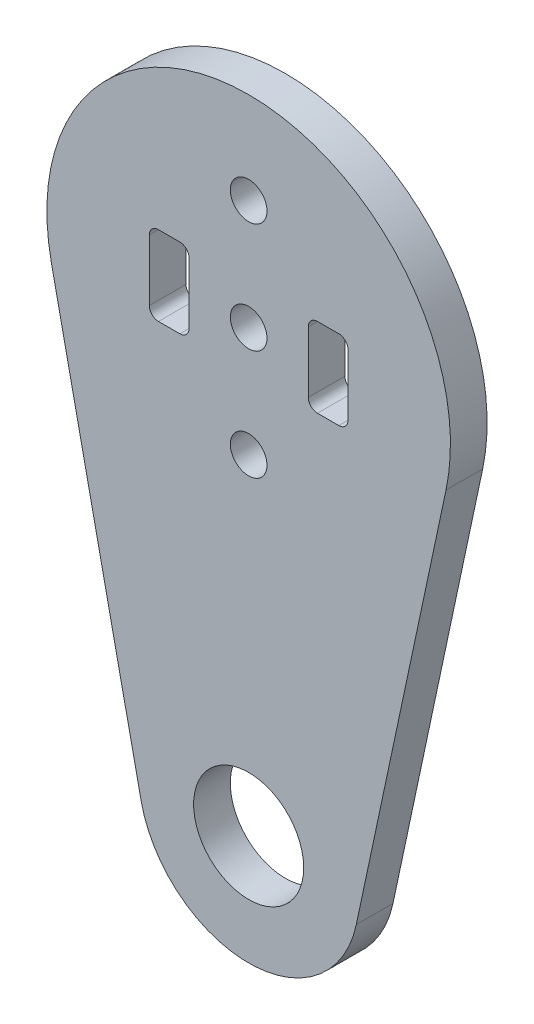
ISO-10303-21;
HEADER;
FILE_DESCRIPTION(('STEP AP214'),'2;1');
FILE_NAME('part.step','',(''),(''),'','','');
FILE_SCHEMA(('AUTOMOTIVE_DESIGN { 1 0 10303 214 1 1 1 1 }'));
ENDSEC;
DATA;
#1=APPLICATION_CONTEXT('core data for automotive mechanical design processes');
#2=APPLICATION_PROTOCOL_DEFINITION('international standard','automotive_design',2000,#1);
#3=PRODUCT_CONTEXT('',#1,'mechanical');
#4=PRODUCT('Part','Part','',(#3));
#5=PRODUCT_RELATED_PRODUCT_CATEGORY('part','',(#4));
#6=PRODUCT_DEFINITION_FORMATION('','',#4);
#7=PRODUCT_DEFINITION_CONTEXT('part definition',#1,'design');
#8=PRODUCT_DEFINITION('design','',#6,#7);
#9=PRODUCT_DEFINITION_SHAPE('','',#8);
#10=(LENGTH_UNIT() NAMED_UNIT(*) SI_UNIT(.MILLI.,.METRE.));
#11=(NAMED_UNIT(*) PLANE_ANGLE_UNIT() SI_UNIT($,.RADIAN.));
#12=(NAMED_UNIT(*) SI_UNIT($,.STERADIAN.) SOLID_ANGLE_UNIT());
#13=UNCERTAINTY_MEASURE_WITH_UNIT(LENGTH_MEASURE(1.E-05),#10,'distance_accuracy_value','');
#14=(GEOMETRIC_REPRESENTATION_CONTEXT(3) GLOBAL_UNCERTAINTY_ASSIGNED_CONTEXT((#13)) GLOBAL_UNIT_ASSIGNED_CONTEXT((#10,
#11,#12)) REPRESENTATION_CONTEXT('',''));
#15=CARTESIAN_POINT('',(0.,0.,0.));
#16=DIRECTION('',(0.,0.,1.));
#17=DIRECTION('',(1.,0.,0.));
#18=AXIS2_PLACEMENT_3D('',#15,#16,#17);
#19=CARTESIAN_POINT('',(215.7478079135,205.9520199932,3.));
#20=DIRECTION('',(0.,0.,1.));
#21=DIRECTION('',(1.,0.,0.));
#22=AXIS2_PLACEMENT_3D('',#19,#20,#21);
#23=PLANE('',#22);
#24=DIRECTION('',(-1.,0.,0.));
#25=VECTOR('',#24,1.);
#26=CARTESIAN_POINT('',(208.3728079135,245.2020199932,3.));
#27=LINE('',#26,#25);
#28=CARTESIAN_POINT('',(210.1228079135,245.2020199932,3.));
#29=VERTEX_POINT('',#28);
#30=CARTESIAN_POINT('',(208.3728079135,245.2020199932,3.));
#31=VERTEX_POINT('',#30);
#32=EDGE_CURVE('E178',#29,#31,#27,.T.);
#33=ORIENTED_EDGE('',*,*,#32,.F.);
#34=CARTESIAN_POINT('',(210.1228079135,244.4520199932,3.));
#35=DIRECTION('',(0.,0.,1.));
#36=DIRECTION('',(1.,0.,0.));
#37=AXIS2_PLACEMENT_3D('',#34,#35,#36);
#38=CIRCLE('',#37,0.750000000000001);
#39=CARTESIAN_POINT('',(210.8728079135,244.4520199932,3.));
#40=VERTEX_POINT('',#39);
#41=EDGE_CURVE('E170',#40,#29,#38,.T.);
#42=ORIENTED_EDGE('',*,*,#41,.F.);
#43=DIRECTION('',(0.,1.,0.));
#44=VECTOR('',#43,1.);
#45=CARTESIAN_POINT('',(210.8728079135,244.4520199932,3.));
#46=LINE('',#45,#44);
#47=CARTESIAN_POINT('',(210.8728079135,239.4520199932,3.));
#48=VERTEX_POINT('',#47);
#49=EDGE_CURVE('E205',#48,#40,#46,.T.);
#50=ORIENTED_EDGE('',*,*,#49,.F.);
#51=CARTESIAN_POINT('',(210.1228079135,239.4520199932,3.));
#52=DIRECTION('',(0.,0.,1.));
#53=DIRECTION('',(1.,0.,0.));
#54=AXIS2_PLACEMENT_3D('',#51,#52,#53);
#55=CIRCLE('',#54,0.750000000000001);
#56=CARTESIAN_POINT('',(210.1228079135,238.7020199932,3.));
#57=VERTEX_POINT('',#56);
#58=EDGE_CURVE('E203',#57,#48,#55,.T.);
#59=ORIENTED_EDGE('',*,*,#58,.F.);
#60=DIRECTION('',(1.,0.,0.));
#61=VECTOR('',#60,1.);
#62=CARTESIAN_POINT('',(210.1228079135,238.7020199932,3.));
#63=LINE('',#62,#61);
#64=CARTESIAN_POINT('',(208.3728079135,238.7020199932,3.));
#65=VERTEX_POINT('',#64);
#66=EDGE_CURVE('E201',#65,#57,#63,.T.);
#67=ORIENTED_EDGE('',*,*,#66,.F.);
#68=CARTESIAN_POINT('',(208.3728079135,239.4520199932,3.));
#69=DIRECTION('',(0.,0.,1.));
#70=DIRECTION('',(1.,0.,0.));
#71=AXIS2_PLACEMENT_3D('',#68,#69,#70);
#72=CIRCLE('',#71,0.750000000000237);
#73=CARTESIAN_POINT('',(207.6228079135,239.4520199932,3.));
#74=VERTEX_POINT('',#73);
#75=EDGE_CURVE('E199',#74,#65,#72,.T.);
#76=ORIENTED_EDGE('',*,*,#75,.F.);
#77=DIRECTION('',(0.,-1.,0.));
#78=VECTOR('',#77,1.);
#79=CARTESIAN_POINT('',(207.6228079135,239.4520199932,3.));
#80=LINE('',#79,#78);
#81=CARTESIAN_POINT('',(207.6228079135,244.4520199932,3.));
#82=VERTEX_POINT('',#81);
#83=EDGE_CURVE('E194',#82,#74,#80,.T.);
#84=ORIENTED_EDGE('',*,*,#83,.F.);
#85=CARTESIAN_POINT('',(208.3728079135,244.4520199932,3.));
#86=DIRECTION('',(0.,0.,1.));
#87=DIRECTION('',(1.,0.,0.));
#88=AXIS2_PLACEMENT_3D('',#85,#86,#87);
#89=CIRCLE('',#88,0.750000000000001);
#90=EDGE_CURVE('E192',#31,#82,#89,.T.);
#91=ORIENTED_EDGE('',*,*,#90,.F.);
#92=EDGE_LOOP('',(#33,#42,#50,#59,#67,#76,#84,#91));
#93=FACE_BOUND('',#92,.T.);
#94=CARTESIAN_POINT('',(215.7478079135,250.9520199932,3.));
#95=DIRECTION('',(0.,0.,1.));
#96=DIRECTION('',(1.,0.,0.));
#97=AXIS2_PLACEMENT_3D('',#94,#95,#96);
#98=CIRCLE('',#97,1.5);
#99=CARTESIAN_POINT('',(217.2478079135,250.9520199932,3.));
#100=VERTEX_POINT('',#99);
#101=EDGE_CURVE('E297',#100,#100,#98,.T.);
#102=ORIENTED_EDGE('',*,*,#101,.F.);
#103=EDGE_LOOP('',(#102));
#104=FACE_BOUND('',#103,.T.);
#105=CARTESIAN_POINT('',(215.7478079135,241.9520199932,3.));
#106=DIRECTION('',(0.,0.,1.));
#107=DIRECTION('',(1.,0.,0.));
#108=AXIS2_PLACEMENT_3D('',#105,#106,#107);
#109=CIRCLE('',#108,1.5);
#110=CARTESIAN_POINT('',(217.2478079135,241.9520199932,3.));
#111=VERTEX_POINT('',#110);
#112=EDGE_CURVE('E309',#111,#111,#109,.T.);
#113=ORIENTED_EDGE('',*,*,#112,.F.);
#114=EDGE_LOOP('',(#113));
#115=FACE_BOUND('',#114,.T.);
#116=CARTESIAN_POINT('',(215.7478079135,205.9520199932,3.));
#117=DIRECTION('',(0.,0.,1.));
#118=DIRECTION('',(1.,0.,0.));
#119=AXIS2_PLACEMENT_3D('',#116,#117,#118);
#120=CIRCLE('',#119,8.99999999997151);
#121=CARTESIAN_POINT('',(206.9452869678,204.0770199932,3.));
#122=VERTEX_POINT('',#121);
#123=CARTESIAN_POINT('',(224.5503288592,204.0770199932,3.));
#124=VERTEX_POINT('',#123);
#125=EDGE_CURVE('E315',#122,#124,#120,.T.);
#126=ORIENTED_EDGE('',*,*,#125,.T.);
#127=DIRECTION('',(0.208333333334938,0.97805788285845,0.));
#128=VECTOR('',#127,1.);
#129=CARTESIAN_POINT('',(231.8857629807,238.5145199932,3.));
#130=LINE('',#129,#128);
#131=CARTESIAN_POINT('',(231.8857629807,238.5145199932,3.));
#132=VERTEX_POINT('',#131);
#133=EDGE_CURVE('E318',#124,#132,#130,.T.);
#134=ORIENTED_EDGE('',*,*,#133,.T.);
#135=CARTESIAN_POINT('',(215.7478079135,241.9520199932,3.));
#136=DIRECTION('',(0.,0.,1.));
#137=DIRECTION('',(1.,0.,0.));
#138=AXIS2_PLACEMENT_3D('',#135,#136,#137);
#139=CIRCLE('',#138,16.5000000000293);
#140=CARTESIAN_POINT('',(199.6098528463,238.5145199932,3.));
#141=VERTEX_POINT('',#140);
#142=EDGE_CURVE('E321',#132,#141,#139,.T.);
#143=ORIENTED_EDGE('',*,*,#142,.T.);
#144=DIRECTION('',(0.208333333334939,-0.97805788285845,0.));
#145=VECTOR('',#144,1.);
#146=CARTESIAN_POINT('',(206.9452869678,204.0770199932,3.));
#147=LINE('',#146,#145);
#148=EDGE_CURVE('E323',#141,#122,#147,.T.);
#149=ORIENTED_EDGE('',*,*,#148,.T.);
#150=EDGE_LOOP('',(#126,#134,#143,#149));
#151=FACE_BOUND('',#150,.T.);
#152=CARTESIAN_POINT('',(215.7478079135,232.9520199932,3.));
#153=DIRECTION('',(0.,0.,1.));
#154=DIRECTION('',(1.,0.,0.));
#155=AXIS2_PLACEMENT_3D('',#152,#153,#154);
#156=CIRCLE('',#155,1.5);
#157=CARTESIAN_POINT('',(217.2478079135,232.9520199932,3.));
#158=VERTEX_POINT('',#157);
#159=EDGE_CURVE('E303',#158,#158,#156,.T.);
#160=ORIENTED_EDGE('',*,*,#159,.F.);
#161=EDGE_LOOP('',(#160));
#162=FACE_BOUND('',#161,.T.);
#163=DIRECTION('',(0.,-1.,0.));
#164=VECTOR('',#163,1.);
#165=CARTESIAN_POINT('',(220.6228079135,244.4520199932,3.));
#166=LINE('',#165,#164);
#167=CARTESIAN_POINT('',(220.6228079135,244.4520199932,3.));
#168=VERTEX_POINT('',#167);
#169=CARTESIAN_POINT('',(220.6228079135,239.4520199932,3.));
#170=VERTEX_POINT('',#169);
#171=EDGE_CURVE('E240',#168,#170,#166,.T.);
#172=ORIENTED_EDGE('',*,*,#171,.F.);
#173=CARTESIAN_POINT('',(221.3728079135,244.4520199932,3.));
#174=DIRECTION('',(0.,0.,1.));
#175=DIRECTION('',(1.,0.,0.));
#176=AXIS2_PLACEMENT_3D('',#173,#174,#175);
#177=CIRCLE('',#176,0.750000000000001);
#178=CARTESIAN_POINT('',(221.3728079135,245.2020199932,3.));
#179=VERTEX_POINT('',#178);
#180=EDGE_CURVE('E238',#179,#168,#177,.T.);
#181=ORIENTED_EDGE('',*,*,#180,.F.);
#182=DIRECTION('',(-1.,0.,0.));
#183=VECTOR('',#182,1.);
#184=CARTESIAN_POINT('',(223.1228079135,245.2020199932,3.));
#185=LINE('',#184,#183);
#186=CARTESIAN_POINT('',(223.1228079135,245.2020199932,3.));
#187=VERTEX_POINT('',#186);
#188=EDGE_CURVE('E254',#187,#179,#185,.T.);
#189=ORIENTED_EDGE('',*,*,#188,.F.);
#190=CARTESIAN_POINT('',(223.1228079135,244.4520199932,3.));
#191=DIRECTION('',(0.,0.,1.));
#192=DIRECTION('',(1.,0.,0.));
#193=AXIS2_PLACEMENT_3D('',#190,#191,#192);
#194=CIRCLE('',#193,0.750000000000001);
#195=CARTESIAN_POINT('',(223.8728079135,244.4520199932,3.));
#196=VERTEX_POINT('',#195);
#197=EDGE_CURVE('E251',#196,#187,#194,.T.);
#198=ORIENTED_EDGE('',*,*,#197,.F.);
#199=DIRECTION('',(0.,1.,0.));
#200=VECTOR('',#199,1.);
#201=CARTESIAN_POINT('',(223.8728079135,239.4520199932,3.));
#202=LINE('',#201,#200);
#203=CARTESIAN_POINT('',(223.8728079135,239.4520199932,3.));
#204=VERTEX_POINT('',#203);
#205=EDGE_CURVE('E249',#204,#196,#202,.T.);
#206=ORIENTED_EDGE('',*,*,#205,.F.);
#207=CARTESIAN_POINT('',(223.1228079135,239.4520199932,3.));
#208=DIRECTION('',(0.,0.,1.));
#209=DIRECTION('',(1.,0.,0.));
#210=AXIS2_PLACEMENT_3D('',#207,#208,#209);
#211=CIRCLE('',#210,0.750000000000001);
#212=CARTESIAN_POINT('',(223.1228079135,238.7020199932,3.));
#213=VERTEX_POINT('',#212);
#214=EDGE_CURVE('E247',#213,#204,#211,.T.);
#215=ORIENTED_EDGE('',*,*,#214,.F.);
#216=DIRECTION('',(1.,0.,0.));
#217=VECTOR('',#216,1.);
#218=CARTESIAN_POINT('',(221.3728079135,238.7020199932,3.));
#219=LINE('',#218,#217);
#220=CARTESIAN_POINT('',(221.3728079135,238.7020199932,3.));
#221=VERTEX_POINT('',#220);
#222=EDGE_CURVE('E245',#221,#213,#219,.T.);
#223=ORIENTED_EDGE('',*,*,#222,.F.);
#224=CARTESIAN_POINT('',(221.3728079135,239.4520199932,3.));
#225=DIRECTION('',(0.,0.,1.));
#226=DIRECTION('',(1.,0.,0.));
#227=AXIS2_PLACEMENT_3D('',#224,#225,#226);
#228=CIRCLE('',#227,0.750000000000001);
#229=EDGE_CURVE('E243',#170,#221,#228,.T.);
#230=ORIENTED_EDGE('',*,*,#229,.F.);
#231=EDGE_LOOP('',(#172,#181,#189,#198,#206,#215,#223,#230));
#232=FACE_BOUND('',#231,.T.);
#233=CARTESIAN_POINT('',(215.7478079135,205.9520199932,3.));
#234=DIRECTION('',(0.,0.,1.));
#235=DIRECTION('',(1.,0.,0.));
#236=AXIS2_PLACEMENT_3D('',#233,#234,#235);
#237=CIRCLE('',#236,4.5);
#238=CARTESIAN_POINT('',(220.2478079135,205.9520199932,3.));
#239=VERTEX_POINT('',#238);
#240=EDGE_CURVE('E208',#239,#239,#237,.T.);
#241=ORIENTED_EDGE('',*,*,#240,.F.);
#242=EDGE_LOOP('',(#241));
#243=FACE_BOUND('',#242,.T.);
#244=ADVANCED_FACE('F33',(#93,#104,#115,#151,#162,#232,#243),#23,.T.);
#245=CARTESIAN_POINT('',(215.7478079135,205.9520199932,0.));
#246=DIRECTION('',(0.,0.,1.));
#247=DIRECTION('',(1.,0.,0.));
#248=AXIS2_PLACEMENT_3D('',#245,#246,#247);
#249=PLANE('',#248);
#250=CARTESIAN_POINT('',(210.1228079135,244.4520199932,0.));
#251=DIRECTION('',(0.,0.,1.));
#252=DIRECTION('',(1.,0.,0.));
#253=AXIS2_PLACEMENT_3D('',#250,#251,#252);
#254=CIRCLE('',#253,0.750000000000001);
#255=CARTESIAN_POINT('',(210.8728079135,244.4520199932,0.));
#256=VERTEX_POINT('',#255);
#257=CARTESIAN_POINT('',(210.1228079135,245.2020199932,0.));
#258=VERTEX_POINT('',#257);
#259=EDGE_CURVE('E56',#256,#258,#254,.T.);
#260=ORIENTED_EDGE('',*,*,#259,.T.);
#261=DIRECTION('',(-1.,0.,0.));
#262=VECTOR('',#261,1.);
#263=CARTESIAN_POINT('',(208.3728079135,245.2020199932,0.));
#264=LINE('',#263,#262);
#265=CARTESIAN_POINT('',(208.3728079135,245.2020199932,0.));
#266=VERTEX_POINT('',#265);
#267=EDGE_CURVE('E185',#258,#266,#264,.T.);
#268=ORIENTED_EDGE('',*,*,#267,.T.);
#269=CARTESIAN_POINT('',(208.3728079135,244.4520199932,0.));
#270=DIRECTION('',(0.,0.,1.));
#271=DIRECTION('',(1.,0.,0.));
#272=AXIS2_PLACEMENT_3D('',#269,#270,#271);
#273=CIRCLE('',#272,0.750000000000001);
#274=CARTESIAN_POINT('',(207.6228079135,244.4520199932,0.));
#275=VERTEX_POINT('',#274);
#276=EDGE_CURVE('E210',#266,#275,#273,.T.);
#277=ORIENTED_EDGE('',*,*,#276,.T.);
#278=DIRECTION('',(0.,-1.,0.));
#279=VECTOR('',#278,1.);
#280=CARTESIAN_POINT('',(207.6228079135,239.4520199932,0.));
#281=LINE('',#280,#279);
#282=CARTESIAN_POINT('',(207.6228079135,239.4520199932,0.));
#283=VERTEX_POINT('',#282);
#284=EDGE_CURVE('E213',#275,#283,#281,.T.);
#285=ORIENTED_EDGE('',*,*,#284,.T.);
#286=CARTESIAN_POINT('',(208.3728079135,239.4520199932,0.));
#287=DIRECTION('',(0.,0.,1.));
#288=DIRECTION('',(1.,0.,0.));
#289=AXIS2_PLACEMENT_3D('',#286,#287,#288);
#290=CIRCLE('',#289,0.750000000000237);
#291=CARTESIAN_POINT('',(208.3728079135,238.7020199932,0.));
#292=VERTEX_POINT('',#291);
#293=EDGE_CURVE('E216',#283,#292,#290,.T.);
#294=ORIENTED_EDGE('',*,*,#293,.T.);
#295=DIRECTION('',(1.,0.,0.));
#296=VECTOR('',#295,1.);
#297=CARTESIAN_POINT('',(210.1228079135,238.7020199932,0.));
#298=LINE('',#297,#296);
#299=CARTESIAN_POINT('',(210.1228079135,238.7020199932,0.));
#300=VERTEX_POINT('',#299);
#301=EDGE_CURVE('E219',#292,#300,#298,.T.);
#302=ORIENTED_EDGE('',*,*,#301,.T.);
#303=CARTESIAN_POINT('',(210.1228079135,239.4520199932,0.));
#304=DIRECTION('',(0.,0.,1.));
#305=DIRECTION('',(1.,0.,0.));
#306=AXIS2_PLACEMENT_3D('',#303,#304,#305);
#307=CIRCLE('',#306,0.750000000000001);
#308=CARTESIAN_POINT('',(210.8728079135,239.4520199932,0.));
#309=VERTEX_POINT('',#308);
#310=EDGE_CURVE('E222',#300,#309,#307,.T.);
#311=ORIENTED_EDGE('',*,*,#310,.T.);
#312=DIRECTION('',(0.,1.,0.));
#313=VECTOR('',#312,1.);
#314=CARTESIAN_POINT('',(210.8728079135,244.4520199932,0.));
#315=LINE('',#314,#313);
#316=EDGE_CURVE('E179',#309,#256,#315,.T.);
#317=ORIENTED_EDGE('',*,*,#316,.T.);
#318=EDGE_LOOP('',(#260,#268,#277,#285,#294,#302,#311,#317));
#319=FACE_BOUND('',#318,.T.);
#320=CARTESIAN_POINT('',(215.7478079135,250.9520199932,0.));
#321=DIRECTION('',(0.,0.,1.));
#322=DIRECTION('',(1.,0.,0.));
#323=AXIS2_PLACEMENT_3D('',#320,#321,#322);
#324=CIRCLE('',#323,1.5);
#325=CARTESIAN_POINT('',(217.2478079135,250.9520199932,0.));
#326=VERTEX_POINT('',#325);
#327=EDGE_CURVE('E296',#326,#326,#324,.T.);
#328=ORIENTED_EDGE('',*,*,#327,.T.);
#329=EDGE_LOOP('',(#328));
#330=FACE_BOUND('',#329,.T.);
#331=CARTESIAN_POINT('',(215.7478079135,241.9520199932,0.));
#332=DIRECTION('',(0.,0.,1.));
#333=DIRECTION('',(1.,0.,0.));
#334=AXIS2_PLACEMENT_3D('',#331,#332,#333);
#335=CIRCLE('',#334,1.5);
#336=CARTESIAN_POINT('',(217.2478079135,241.9520199932,0.));
#337=VERTEX_POINT('',#336);
#338=EDGE_CURVE('E306',#337,#337,#335,.T.);
#339=ORIENTED_EDGE('',*,*,#338,.T.);
#340=EDGE_LOOP('',(#339));
#341=FACE_BOUND('',#340,.T.);
#342=CARTESIAN_POINT('',(215.7478079135,205.9520199932,0.));
#343=DIRECTION('',(0.,0.,1.));
#344=DIRECTION('',(1.,0.,0.));
#345=AXIS2_PLACEMENT_3D('',#342,#343,#344);
#346=CIRCLE('',#345,8.99999999997151);
#347=CARTESIAN_POINT('',(206.9452869678,204.0770199932,0.));
#348=VERTEX_POINT('',#347);
#349=CARTESIAN_POINT('',(224.5503288592,204.0770199932,0.));
#350=VERTEX_POINT('',#349);
#351=EDGE_CURVE('E312',#348,#350,#346,.T.);
#352=ORIENTED_EDGE('',*,*,#351,.F.);
#353=DIRECTION('',(0.208333333334939,-0.97805788285845,0.));
#354=VECTOR('',#353,1.);
#355=CARTESIAN_POINT('',(206.9452869678,204.0770199932,0.));
#356=LINE('',#355,#354);
#357=CARTESIAN_POINT('',(199.6098528463,238.5145199932,0.));
#358=VERTEX_POINT('',#357);
#359=EDGE_CURVE('E319',#358,#348,#356,.T.);
#360=ORIENTED_EDGE('',*,*,#359,.F.);
#361=CARTESIAN_POINT('',(215.7478079135,241.9520199932,0.));
#362=DIRECTION('',(0.,0.,1.));
#363=DIRECTION('',(1.,0.,0.));
#364=AXIS2_PLACEMENT_3D('',#361,#362,#363);
#365=CIRCLE('',#364,16.5000000000293);
#366=CARTESIAN_POINT('',(231.8857629807,238.5145199932,0.));
#367=VERTEX_POINT('',#366);
#368=EDGE_CURVE('E330',#367,#358,#365,.T.);
#369=ORIENTED_EDGE('',*,*,#368,.F.);
#370=DIRECTION('',(0.208333333334938,0.97805788285845,0.));
#371=VECTOR('',#370,1.);
#372=CARTESIAN_POINT('',(231.8857629807,238.5145199932,0.));
#373=LINE('',#372,#371);
#374=EDGE_CURVE('E328',#350,#367,#373,.T.);
#375=ORIENTED_EDGE('',*,*,#374,.F.);
#376=EDGE_LOOP('',(#352,#360,#369,#375));
#377=FACE_BOUND('',#376,.T.);
#378=CARTESIAN_POINT('',(215.7478079135,232.9520199932,0.));
#379=DIRECTION('',(0.,0.,1.));
#380=DIRECTION('',(1.,0.,0.));
#381=AXIS2_PLACEMENT_3D('',#378,#379,#380);
#382=CIRCLE('',#381,1.5);
#383=CARTESIAN_POINT('',(217.2478079135,232.9520199932,0.));
#384=VERTEX_POINT('',#383);
#385=EDGE_CURVE('E300',#384,#384,#382,.T.);
#386=ORIENTED_EDGE('',*,*,#385,.T.);
#387=EDGE_LOOP('',(#386));
#388=FACE_BOUND('',#387,.T.);
#389=CARTESIAN_POINT('',(221.3728079135,244.4520199932,0.));
#390=DIRECTION('',(0.,0.,1.));
#391=DIRECTION('',(1.,0.,0.));
#392=AXIS2_PLACEMENT_3D('',#389,#390,#391);
#393=CIRCLE('',#392,0.750000000000001);
#394=CARTESIAN_POINT('',(221.3728079135,245.2020199932,0.));
#395=VERTEX_POINT('',#394);
#396=CARTESIAN_POINT('',(220.6228079135,244.4520199932,0.));
#397=VERTEX_POINT('',#396);
#398=EDGE_CURVE('E186',#395,#397,#393,.T.);
#399=ORIENTED_EDGE('',*,*,#398,.T.);
#400=DIRECTION('',(0.,-1.,0.));
#401=VECTOR('',#400,1.);
#402=CARTESIAN_POINT('',(220.6228079135,244.4520199932,0.));
#403=LINE('',#402,#401);
#404=CARTESIAN_POINT('',(220.6228079135,239.4520199932,0.));
#405=VERTEX_POINT('',#404);
#406=EDGE_CURVE('E259',#397,#405,#403,.T.);
#407=ORIENTED_EDGE('',*,*,#406,.T.);
#408=CARTESIAN_POINT('',(221.3728079135,239.4520199932,0.));
#409=DIRECTION('',(0.,0.,1.));
#410=DIRECTION('',(1.,0.,0.));
#411=AXIS2_PLACEMENT_3D('',#408,#409,#410);
#412=CIRCLE('',#411,0.750000000000001);
#413=CARTESIAN_POINT('',(221.3728079135,238.7020199932,0.));
#414=VERTEX_POINT('',#413);
#415=EDGE_CURVE('E262',#405,#414,#412,.T.);
#416=ORIENTED_EDGE('',*,*,#415,.T.);
#417=DIRECTION('',(1.,0.,0.));
#418=VECTOR('',#417,1.);
#419=CARTESIAN_POINT('',(221.3728079135,238.7020199932,0.));
#420=LINE('',#419,#418);
#421=CARTESIAN_POINT('',(223.1228079135,238.7020199932,0.));
#422=VERTEX_POINT('',#421);
#423=EDGE_CURVE('E265',#414,#422,#420,.T.);
#424=ORIENTED_EDGE('',*,*,#423,.T.);
#425=CARTESIAN_POINT('',(223.1228079135,239.4520199932,0.));
#426=DIRECTION('',(0.,0.,1.));
#427=DIRECTION('',(1.,0.,0.));
#428=AXIS2_PLACEMENT_3D('',#425,#426,#427);
#429=CIRCLE('',#428,0.750000000000001);
#430=CARTESIAN_POINT('',(223.8728079135,239.4520199932,0.));
#431=VERTEX_POINT('',#430);
#432=EDGE_CURVE('E268',#422,#431,#429,.T.);
#433=ORIENTED_EDGE('',*,*,#432,.T.);
#434=DIRECTION('',(0.,1.,0.));
#435=VECTOR('',#434,1.);
#436=CARTESIAN_POINT('',(223.8728079135,239.4520199932,0.));
#437=LINE('',#436,#435);
#438=CARTESIAN_POINT('',(223.8728079135,244.4520199932,0.));
#439=VERTEX_POINT('',#438);
#440=EDGE_CURVE('E271',#431,#439,#437,.T.);
#441=ORIENTED_EDGE('',*,*,#440,.T.);
#442=CARTESIAN_POINT('',(223.1228079135,244.4520199932,0.));
#443=DIRECTION('',(0.,0.,1.));
#444=DIRECTION('',(1.,0.,0.));
#445=AXIS2_PLACEMENT_3D('',#442,#443,#444);
#446=CIRCLE('',#445,0.750000000000001);
#447=CARTESIAN_POINT('',(223.1228079135,245.2020199932,0.));
#448=VERTEX_POINT('',#447);
#449=EDGE_CURVE('E274',#439,#448,#446,.T.);
#450=ORIENTED_EDGE('',*,*,#449,.T.);
#451=DIRECTION('',(-1.,0.,0.));
#452=VECTOR('',#451,1.);
#453=CARTESIAN_POINT('',(223.1228079135,245.2020199932,0.));
#454=LINE('',#453,#452);
#455=EDGE_CURVE('E241',#448,#395,#454,.T.);
#456=ORIENTED_EDGE('',*,*,#455,.T.);
#457=EDGE_LOOP('',(#399,#407,#416,#424,#433,#441,#450,#456));
#458=FACE_BOUND('',#457,.T.);
#459=CARTESIAN_POINT('',(215.7478079135,205.9520199932,0.));
#460=DIRECTION('',(0.,0.,1.));
#461=DIRECTION('',(1.,0.,0.));
#462=AXIS2_PLACEMENT_3D('',#459,#460,#461);
#463=CIRCLE('',#462,4.5);
#464=CARTESIAN_POINT('',(220.2478079135,205.9520199932,0.));
#465=VERTEX_POINT('',#464);
#466=EDGE_CURVE('E469',#465,#465,#463,.T.);
#467=ORIENTED_EDGE('',*,*,#466,.T.);
#468=EDGE_LOOP('',(#467));
#469=FACE_BOUND('',#468,.T.);
#470=ADVANCED_FACE('F348',(#319,#330,#341,#377,#388,#458,#469),#249,.F.);
#471=CARTESIAN_POINT('',(215.7478079135,205.9520199932,3.));
#472=DIRECTION('',(0.,0.,-1.));
#473=DIRECTION('',(-1.,0.,0.));
#474=AXIS2_PLACEMENT_3D('',#471,#472,#473);
#475=CYLINDRICAL_SURFACE('',#474,8.99999999997151);
#476=ORIENTED_EDGE('',*,*,#351,.T.);
#477=DIRECTION('',(0.,0.,-1.));
#478=VECTOR('',#477,1.);
#479=CARTESIAN_POINT('',(224.5503288592,204.0770199932,3.));
#480=LINE('',#479,#478);
#481=EDGE_CURVE('E11',#124,#350,#480,.T.);
#482=ORIENTED_EDGE('',*,*,#481,.F.);
#483=ORIENTED_EDGE('',*,*,#125,.F.);
#484=DIRECTION('',(0.,0.,-1.));
#485=VECTOR('',#484,1.);
#486=CARTESIAN_POINT('',(206.9452869678,204.0770199932,3.));
#487=LINE('',#486,#485);
#488=EDGE_CURVE('E325',#122,#348,#487,.T.);
#489=ORIENTED_EDGE('',*,*,#488,.T.);
#490=EDGE_LOOP('',(#476,#482,#483,#489));
#491=FACE_BOUND('',#490,.T.);
#492=ADVANCED_FACE('F35',(#491),#475,.T.);
#493=CARTESIAN_POINT('',(231.8857629807,238.5145199932,3.));
#494=DIRECTION('',(-0.97805788285845,0.208333333334938,0.));
#495=DIRECTION('',(-0.208333333334938,-0.97805788285845,0.));
#496=AXIS2_PLACEMENT_3D('',#493,#494,#495);
#497=PLANE('',#496);
#498=ORIENTED_EDGE('',*,*,#374,.T.);
#499=DIRECTION('',(0.,0.,-1.));
#500=VECTOR('',#499,1.);
#501=CARTESIAN_POINT('',(231.8857629807,238.5145199932,3.));
#502=LINE('',#501,#500);
#503=EDGE_CURVE('E41',#132,#367,#502,.T.);
#504=ORIENTED_EDGE('',*,*,#503,.F.);
#505=ORIENTED_EDGE('',*,*,#133,.F.);
#506=ORIENTED_EDGE('',*,*,#481,.T.);
#507=EDGE_LOOP('',(#498,#504,#505,#506));
#508=FACE_BOUND('',#507,.T.);
#509=ADVANCED_FACE('F359',(#508),#497,.F.);
#510=CARTESIAN_POINT('',(215.7478079135,241.9520199932,3.));
#511=DIRECTION('',(0.,0.,-1.));
#512=DIRECTION('',(-1.,0.,0.));
#513=AXIS2_PLACEMENT_3D('',#510,#511,#512);
#514=CYLINDRICAL_SURFACE('',#513,16.5000000000293);
#515=ORIENTED_EDGE('',*,*,#368,.T.);
#516=DIRECTION('',(0.,0.,-1.));
#517=VECTOR('',#516,1.);
#518=CARTESIAN_POINT('',(199.6098528463,238.5145199932,3.));
#519=LINE('',#518,#517);
#520=EDGE_CURVE('E335',#141,#358,#519,.T.);
#521=ORIENTED_EDGE('',*,*,#520,.F.);
#522=ORIENTED_EDGE('',*,*,#142,.F.);
#523=ORIENTED_EDGE('',*,*,#503,.T.);
#524=EDGE_LOOP('',(#515,#521,#522,#523));
#525=FACE_BOUND('',#524,.T.);
#526=ADVANCED_FACE('F342',(#525),#514,.T.);
#527=CARTESIAN_POINT('',(206.9452869678,204.0770199932,3.));
#528=DIRECTION('',(0.97805788285845,0.208333333334939,0.));
#529=DIRECTION('',(-0.208333333334939,0.97805788285845,0.));
#530=AXIS2_PLACEMENT_3D('',#527,#528,#529);
#531=PLANE('',#530);
#532=ORIENTED_EDGE('',*,*,#359,.T.);
#533=ORIENTED_EDGE('',*,*,#488,.F.);
#534=ORIENTED_EDGE('',*,*,#148,.F.);
#535=ORIENTED_EDGE('',*,*,#520,.T.);
#536=EDGE_LOOP('',(#532,#533,#534,#535));
#537=FACE_BOUND('',#536,.T.);
#538=ADVANCED_FACE('F352',(#537),#531,.F.);
#539=CARTESIAN_POINT('',(215.7478079135,241.9520199932,3.));
#540=DIRECTION('',(0.,0.,-1.));
#541=DIRECTION('',(-1.,0.,0.));
#542=AXIS2_PLACEMENT_3D('',#539,#540,#541);
#543=CYLINDRICAL_SURFACE('',#542,1.5);
#544=ORIENTED_EDGE('',*,*,#112,.T.);
#545=EDGE_LOOP('',(#544));
#546=FACE_BOUND('',#545,.T.);
#547=ORIENTED_EDGE('',*,*,#338,.F.);
#548=EDGE_LOOP('',(#547));
#549=FACE_BOUND('',#548,.T.);
#550=ADVANCED_FACE('F374',(#546,#549),#543,.F.);
#551=CARTESIAN_POINT('',(215.7478079135,232.9520199932,3.));
#552=DIRECTION('',(0.,0.,-1.));
#553=DIRECTION('',(-1.,0.,0.));
#554=AXIS2_PLACEMENT_3D('',#551,#552,#553);
#555=CYLINDRICAL_SURFACE('',#554,1.5);
#556=ORIENTED_EDGE('',*,*,#159,.T.);
#557=EDGE_LOOP('',(#556));
#558=FACE_BOUND('',#557,.T.);
#559=ORIENTED_EDGE('',*,*,#385,.F.);
#560=EDGE_LOOP('',(#559));
#561=FACE_BOUND('',#560,.T.);
#562=ADVANCED_FACE('F381',(#558,#561),#555,.F.);
#563=CARTESIAN_POINT('',(215.7478079135,250.9520199932,3.));
#564=DIRECTION('',(0.,0.,-1.));
#565=DIRECTION('',(-1.,0.,0.));
#566=AXIS2_PLACEMENT_3D('',#563,#564,#565);
#567=CYLINDRICAL_SURFACE('',#566,1.5);
#568=ORIENTED_EDGE('',*,*,#101,.T.);
#569=EDGE_LOOP('',(#568));
#570=FACE_BOUND('',#569,.T.);
#571=ORIENTED_EDGE('',*,*,#327,.F.);
#572=EDGE_LOOP('',(#571));
#573=FACE_BOUND('',#572,.T.);
#574=ADVANCED_FACE('F386',(#570,#573),#567,.F.);
#575=CARTESIAN_POINT('',(221.3728079135,244.4520199932,3.));
#576=DIRECTION('',(0.,0.,-1.));
#577=DIRECTION('',(-1.,0.,0.));
#578=AXIS2_PLACEMENT_3D('',#575,#576,#577);
#579=CYLINDRICAL_SURFACE('',#578,0.750000000000001);
#580=ORIENTED_EDGE('',*,*,#398,.F.);
#581=DIRECTION('',(0.,0.,-1.));
#582=VECTOR('',#581,1.);
#583=CARTESIAN_POINT('',(221.3728079135,245.2020199932,3.));
#584=LINE('',#583,#582);
#585=EDGE_CURVE('E256',#179,#395,#584,.T.);
#586=ORIENTED_EDGE('',*,*,#585,.F.);
#587=ORIENTED_EDGE('',*,*,#180,.T.);
#588=DIRECTION('',(0.,0.,-1.));
#589=VECTOR('',#588,1.);
#590=CARTESIAN_POINT('',(220.6228079135,244.4520199932,3.));
#591=LINE('',#590,#589);
#592=EDGE_CURVE('E293',#168,#397,#591,.T.);
#593=ORIENTED_EDGE('',*,*,#592,.T.);
#594=EDGE_LOOP('',(#580,#586,#587,#593));
#595=FACE_BOUND('',#594,.T.);
#596=ADVANCED_FACE('F396',(#595),#579,.F.);
#597=CARTESIAN_POINT('',(220.6228079135,244.4520199932,3.));
#598=DIRECTION('',(1.,0.,0.));
#599=DIRECTION('',(0.,0.,-1.));
#600=AXIS2_PLACEMENT_3D('',#597,#598,#599);
#601=PLANE('',#600);
#602=ORIENTED_EDGE('',*,*,#406,.F.);
#603=ORIENTED_EDGE('',*,*,#592,.F.);
#604=ORIENTED_EDGE('',*,*,#171,.T.);
#605=DIRECTION('',(0.,0.,-1.));
#606=VECTOR('',#605,1.);
#607=CARTESIAN_POINT('',(220.6228079135,239.4520199932,3.));
#608=LINE('',#607,#606);
#609=EDGE_CURVE('E291',#170,#405,#608,.T.);
#610=ORIENTED_EDGE('',*,*,#609,.T.);
#611=EDGE_LOOP('',(#602,#603,#604,#610));
#612=FACE_BOUND('',#611,.T.);
#613=ADVANCED_FACE('F403',(#612),#601,.T.);
#614=CARTESIAN_POINT('',(221.3728079135,239.4520199932,3.));
#615=DIRECTION('',(0.,0.,-1.));
#616=DIRECTION('',(-1.,0.,0.));
#617=AXIS2_PLACEMENT_3D('',#614,#615,#616);
#618=CYLINDRICAL_SURFACE('',#617,0.750000000000001);
#619=ORIENTED_EDGE('',*,*,#415,.F.);
#620=ORIENTED_EDGE('',*,*,#609,.F.);
#621=ORIENTED_EDGE('',*,*,#229,.T.);
#622=DIRECTION('',(0.,0.,-1.));
#623=VECTOR('',#622,1.);
#624=CARTESIAN_POINT('',(221.3728079135,238.7020199932,3.));
#625=LINE('',#624,#623);
#626=EDGE_CURVE('E289',#221,#414,#625,.T.);
#627=ORIENTED_EDGE('',*,*,#626,.T.);
#628=EDGE_LOOP('',(#619,#620,#621,#627));
#629=FACE_BOUND('',#628,.T.);
#630=ADVANCED_FACE('F407',(#629),#618,.F.);
#631=CARTESIAN_POINT('',(221.3728079135,238.7020199932,3.));
#632=DIRECTION('',(0.,1.,0.));
#633=DIRECTION('',(0.,0.,1.));
#634=AXIS2_PLACEMENT_3D('',#631,#632,#633);
#635=PLANE('',#634);
#636=ORIENTED_EDGE('',*,*,#423,.F.);
#637=ORIENTED_EDGE('',*,*,#626,.F.);
#638=ORIENTED_EDGE('',*,*,#222,.T.);
#639=DIRECTION('',(0.,0.,-1.));
#640=VECTOR('',#639,1.);
#641=CARTESIAN_POINT('',(223.1228079135,238.7020199932,3.));
#642=LINE('',#641,#640);
#643=EDGE_CURVE('E287',#213,#422,#642,.T.);
#644=ORIENTED_EDGE('',*,*,#643,.T.);
#645=EDGE_LOOP('',(#636,#637,#638,#644));
#646=FACE_BOUND('',#645,.T.);
#647=ADVANCED_FACE('F411',(#646),#635,.T.);
#648=CARTESIAN_POINT('',(223.1228079135,239.4520199932,3.));
#649=DIRECTION('',(0.,0.,-1.));
#650=DIRECTION('',(-1.,0.,0.));
#651=AXIS2_PLACEMENT_3D('',#648,#649,#650);
#652=CYLINDRICAL_SURFACE('',#651,0.750000000000001);
#653=ORIENTED_EDGE('',*,*,#432,.F.);
#654=ORIENTED_EDGE('',*,*,#643,.F.);
#655=ORIENTED_EDGE('',*,*,#214,.T.);
#656=DIRECTION('',(0.,0.,-1.));
#657=VECTOR('',#656,1.);
#658=CARTESIAN_POINT('',(223.8728079135,239.4520199932,3.));
#659=LINE('',#658,#657);
#660=EDGE_CURVE('E285',#204,#431,#659,.T.);
#661=ORIENTED_EDGE('',*,*,#660,.T.);
#662=EDGE_LOOP('',(#653,#654,#655,#661));
#663=FACE_BOUND('',#662,.T.);
#664=ADVANCED_FACE('F415',(#663),#652,.F.);
#665=CARTESIAN_POINT('',(223.8728079135,239.4520199932,3.));
#666=DIRECTION('',(-1.,0.,0.));
#667=DIRECTION('',(0.,0.,1.));
#668=AXIS2_PLACEMENT_3D('',#665,#666,#667);
#669=PLANE('',#668);
#670=ORIENTED_EDGE('',*,*,#440,.F.);
#671=ORIENTED_EDGE('',*,*,#660,.F.);
#672=ORIENTED_EDGE('',*,*,#205,.T.);
#673=DIRECTION('',(0.,0.,-1.));
#674=VECTOR('',#673,1.);
#675=CARTESIAN_POINT('',(223.8728079135,244.4520199932,3.));
#676=LINE('',#675,#674);
#677=EDGE_CURVE('E283',#196,#439,#676,.T.);
#678=ORIENTED_EDGE('',*,*,#677,.T.);
#679=EDGE_LOOP('',(#670,#671,#672,#678));
#680=FACE_BOUND('',#679,.T.);
#681=ADVANCED_FACE('F419',(#680),#669,.T.);
#682=CARTESIAN_POINT('',(223.1228079135,244.4520199932,3.));
#683=DIRECTION('',(0.,0.,-1.));
#684=DIRECTION('',(-1.,0.,0.));
#685=AXIS2_PLACEMENT_3D('',#682,#683,#684);
#686=CYLINDRICAL_SURFACE('',#685,0.750000000000001);
#687=ORIENTED_EDGE('',*,*,#449,.F.);
#688=ORIENTED_EDGE('',*,*,#677,.F.);
#689=ORIENTED_EDGE('',*,*,#197,.T.);
#690=DIRECTION('',(0.,0.,-1.));
#691=VECTOR('',#690,1.);
#692=CARTESIAN_POINT('',(223.1228079135,245.2020199932,3.));
#693=LINE('',#692,#691);
#694=EDGE_CURVE('E281',#187,#448,#693,.T.);
#695=ORIENTED_EDGE('',*,*,#694,.T.);
#696=EDGE_LOOP('',(#687,#688,#689,#695));
#697=FACE_BOUND('',#696,.T.);
#698=ADVANCED_FACE('F423',(#697),#686,.F.);
#699=CARTESIAN_POINT('',(223.1228079135,245.2020199932,3.));
#700=DIRECTION('',(0.,-1.,0.));
#701=DIRECTION('',(0.,0.,-1.));
#702=AXIS2_PLACEMENT_3D('',#699,#700,#701);
#703=PLANE('',#702);
#704=ORIENTED_EDGE('',*,*,#455,.F.);
#705=ORIENTED_EDGE('',*,*,#694,.F.);
#706=ORIENTED_EDGE('',*,*,#188,.T.);
#707=ORIENTED_EDGE('',*,*,#585,.T.);
#708=EDGE_LOOP('',(#704,#705,#706,#707));
#709=FACE_BOUND('',#708,.T.);
#710=ADVANCED_FACE('F427',(#709),#703,.T.);
#711=CARTESIAN_POINT('',(210.1228079135,244.4520199932,3.));
#712=DIRECTION('',(0.,0.,-1.));
#713=DIRECTION('',(-1.,0.,0.));
#714=AXIS2_PLACEMENT_3D('',#711,#712,#713);
#715=CYLINDRICAL_SURFACE('',#714,0.750000000000001);
#716=ORIENTED_EDGE('',*,*,#259,.F.);
#717=DIRECTION('',(0.,0.,-1.));
#718=VECTOR('',#717,1.);
#719=CARTESIAN_POINT('',(210.8728079135,244.4520199932,3.));
#720=LINE('',#719,#718);
#721=EDGE_CURVE('E174',#40,#256,#720,.T.);
#722=ORIENTED_EDGE('',*,*,#721,.F.);
#723=ORIENTED_EDGE('',*,*,#41,.T.);
#724=DIRECTION('',(0.,0.,-1.));
#725=VECTOR('',#724,1.);
#726=CARTESIAN_POINT('',(210.1228079135,245.2020199932,3.));
#727=LINE('',#726,#725);
#728=EDGE_CURVE('E173',#29,#258,#727,.T.);
#729=ORIENTED_EDGE('',*,*,#728,.T.);
#730=EDGE_LOOP('',(#716,#722,#723,#729));
#731=FACE_BOUND('',#730,.T.);
#732=ADVANCED_FACE('F172',(#731),#715,.F.);
#733=CARTESIAN_POINT('',(208.3728079135,245.2020199932,3.));
#734=DIRECTION('',(0.,-1.,0.));
#735=DIRECTION('',(0.,0.,-1.));
#736=AXIS2_PLACEMENT_3D('',#733,#734,#735);
#737=PLANE('',#736);
#738=ORIENTED_EDGE('',*,*,#267,.F.);
#739=ORIENTED_EDGE('',*,*,#728,.F.);
#740=ORIENTED_EDGE('',*,*,#32,.T.);
#741=DIRECTION('',(0.,0.,-1.));
#742=VECTOR('',#741,1.);
#743=CARTESIAN_POINT('',(208.3728079135,245.2020199932,3.));
#744=LINE('',#743,#742);
#745=EDGE_CURVE('E187',#31,#266,#744,.T.);
#746=ORIENTED_EDGE('',*,*,#745,.T.);
#747=EDGE_LOOP('',(#738,#739,#740,#746));
#748=FACE_BOUND('',#747,.T.);
#749=ADVANCED_FACE('F182',(#748),#737,.T.);
#750=CARTESIAN_POINT('',(208.3728079135,244.4520199932,3.));
#751=DIRECTION('',(0.,0.,-1.));
#752=DIRECTION('',(-1.,0.,0.));
#753=AXIS2_PLACEMENT_3D('',#750,#751,#752);
#754=CYLINDRICAL_SURFACE('',#753,0.750000000000001);
#755=ORIENTED_EDGE('',*,*,#276,.F.);
#756=ORIENTED_EDGE('',*,*,#745,.F.);
#757=ORIENTED_EDGE('',*,*,#90,.T.);
#758=DIRECTION('',(0.,0.,-1.));
#759=VECTOR('',#758,1.);
#760=CARTESIAN_POINT('',(207.6228079135,244.4520199932,3.));
#761=LINE('',#760,#759);
#762=EDGE_CURVE('E235',#82,#275,#761,.T.);
#763=ORIENTED_EDGE('',*,*,#762,.T.);
#764=EDGE_LOOP('',(#755,#756,#757,#763));
#765=FACE_BOUND('',#764,.T.);
#766=ADVANCED_FACE('F436',(#765),#754,.F.);
#767=CARTESIAN_POINT('',(207.6228079135,239.4520199932,3.));
#768=DIRECTION('',(1.,0.,0.));
#769=DIRECTION('',(0.,0.,-1.));
#770=AXIS2_PLACEMENT_3D('',#767,#768,#769);
#771=PLANE('',#770);
#772=ORIENTED_EDGE('',*,*,#284,.F.);
#773=ORIENTED_EDGE('',*,*,#762,.F.);
#774=ORIENTED_EDGE('',*,*,#83,.T.);
#775=DIRECTION('',(0.,0.,-1.));
#776=VECTOR('',#775,1.);
#777=CARTESIAN_POINT('',(207.6228079135,239.4520199932,3.));
#778=LINE('',#777,#776);
#779=EDGE_CURVE('E233',#74,#283,#778,.T.);
#780=ORIENTED_EDGE('',*,*,#779,.T.);
#781=EDGE_LOOP('',(#772,#773,#774,#780));
#782=FACE_BOUND('',#781,.T.);
#783=ADVANCED_FACE('F439',(#782),#771,.T.);
#784=CARTESIAN_POINT('',(208.3728079135,239.4520199932,3.));
#785=DIRECTION('',(0.,0.,-1.));
#786=DIRECTION('',(-1.,0.,0.));
#787=AXIS2_PLACEMENT_3D('',#784,#785,#786);
#788=CYLINDRICAL_SURFACE('',#787,0.750000000000237);
#789=ORIENTED_EDGE('',*,*,#293,.F.);
#790=ORIENTED_EDGE('',*,*,#779,.F.);
#791=ORIENTED_EDGE('',*,*,#75,.T.);
#792=DIRECTION('',(0.,0.,-1.));
#793=VECTOR('',#792,1.);
#794=CARTESIAN_POINT('',(208.3728079135,238.7020199932,3.));
#795=LINE('',#794,#793);
#796=EDGE_CURVE('E231',#65,#292,#795,.T.);
#797=ORIENTED_EDGE('',*,*,#796,.T.);
#798=EDGE_LOOP('',(#789,#790,#791,#797));
#799=FACE_BOUND('',#798,.T.);
#800=ADVANCED_FACE('F443',(#799),#788,.F.);
#801=CARTESIAN_POINT('',(210.1228079135,238.7020199932,3.));
#802=DIRECTION('',(0.,1.,0.));
#803=DIRECTION('',(0.,0.,1.));
#804=AXIS2_PLACEMENT_3D('',#801,#802,#803);
#805=PLANE('',#804);
#806=ORIENTED_EDGE('',*,*,#301,.F.);
#807=ORIENTED_EDGE('',*,*,#796,.F.);
#808=ORIENTED_EDGE('',*,*,#66,.T.);
#809=DIRECTION('',(0.,0.,-1.));
#810=VECTOR('',#809,1.);
#811=CARTESIAN_POINT('',(210.1228079135,238.7020199932,3.));
#812=LINE('',#811,#810);
#813=EDGE_CURVE('E229',#57,#300,#812,.T.);
#814=ORIENTED_EDGE('',*,*,#813,.T.);
#815=EDGE_LOOP('',(#806,#807,#808,#814));
#816=FACE_BOUND('',#815,.T.);
#817=ADVANCED_FACE('F447',(#816),#805,.T.);
#818=CARTESIAN_POINT('',(210.1228079135,239.4520199932,3.));
#819=DIRECTION('',(0.,0.,-1.));
#820=DIRECTION('',(-1.,0.,0.));
#821=AXIS2_PLACEMENT_3D('',#818,#819,#820);
#822=CYLINDRICAL_SURFACE('',#821,0.750000000000001);
#823=ORIENTED_EDGE('',*,*,#310,.F.);
#824=ORIENTED_EDGE('',*,*,#813,.F.);
#825=ORIENTED_EDGE('',*,*,#58,.T.);
#826=DIRECTION('',(0.,0.,-1.));
#827=VECTOR('',#826,1.);
#828=CARTESIAN_POINT('',(210.8728079135,239.4520199932,3.));
#829=LINE('',#828,#827);
#830=EDGE_CURVE('E48',#48,#309,#829,.T.);
#831=ORIENTED_EDGE('',*,*,#830,.T.);
#832=EDGE_LOOP('',(#823,#824,#825,#831));
#833=FACE_BOUND('',#832,.T.);
#834=ADVANCED_FACE('F451',(#833),#822,.F.);
#835=CARTESIAN_POINT('',(210.8728079135,244.4520199932,3.));
#836=DIRECTION('',(-1.,0.,0.));
#837=DIRECTION('',(0.,0.,1.));
#838=AXIS2_PLACEMENT_3D('',#835,#836,#837);
#839=PLANE('',#838);
#840=ORIENTED_EDGE('',*,*,#316,.F.);
#841=ORIENTED_EDGE('',*,*,#830,.F.);
#842=ORIENTED_EDGE('',*,*,#49,.T.);
#843=ORIENTED_EDGE('',*,*,#721,.T.);
#844=EDGE_LOOP('',(#840,#841,#842,#843));
#845=FACE_BOUND('',#844,.T.);
#846=ADVANCED_FACE('F455',(#845),#839,.T.);
#847=CARTESIAN_POINT('',(215.7478079135,205.9520199932,3.));
#848=DIRECTION('',(0.,0.,-1.));
#849=DIRECTION('',(-1.,0.,0.));
#850=AXIS2_PLACEMENT_3D('',#847,#848,#849);
#851=CYLINDRICAL_SURFACE('',#850,4.5);
#852=ORIENTED_EDGE('',*,*,#240,.T.);
#853=EDGE_LOOP('',(#852));
#854=FACE_BOUND('',#853,.T.);
#855=ORIENTED_EDGE('',*,*,#466,.F.);
#856=EDGE_LOOP('',(#855));
#857=FACE_BOUND('',#856,.T.);
#858=ADVANCED_FACE('F459',(#854,#857),#851,.F.);
#859=CLOSED_SHELL('',(#244,#470,#492,#509,#526,#538,#550,#562,#574,#596,#613,#630,#647,#664,
#681,#698,#710,#732,#749,#766,#783,#800,#817,#834,#846,#858));
#860=MANIFOLD_SOLID_BREP('B2',#859);
#861=ADVANCED_BREP_SHAPE_REPRESENTATION('',(#18,#860),#14);
#862=SHAPE_DEFINITION_REPRESENTATION(#9,#861);
ENDSEC;
END-ISO-10303-21;
